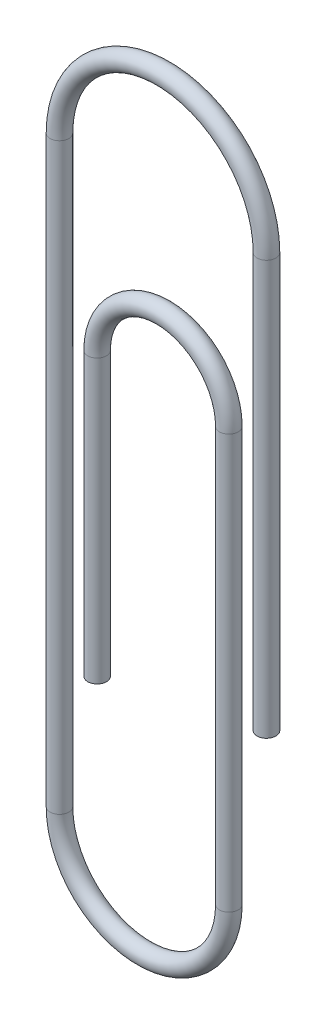
ISO-10303-21;
HEADER;
FILE_DESCRIPTION(('STEP AP214'),'2;1');
FILE_NAME('part.step','',(''),(''),'','','');
FILE_SCHEMA(('AUTOMOTIVE_DESIGN { 1 0 10303 214 1 1 1 1 }'));
ENDSEC;
DATA;
#1=APPLICATION_CONTEXT('core data for automotive mechanical design processes');
#2=APPLICATION_PROTOCOL_DEFINITION('international standard','automotive_design',2000,#1);
#3=PRODUCT_CONTEXT('',#1,'mechanical');
#4=PRODUCT('Part','Part','',(#3));
#5=PRODUCT_RELATED_PRODUCT_CATEGORY('part','',(#4));
#6=PRODUCT_DEFINITION_FORMATION('','',#4);
#7=PRODUCT_DEFINITION_CONTEXT('part definition',#1,'design');
#8=PRODUCT_DEFINITION('design','',#6,#7);
#9=PRODUCT_DEFINITION_SHAPE('','',#8);
#10=(LENGTH_UNIT() NAMED_UNIT(*) SI_UNIT(.MILLI.,.METRE.));
#11=(NAMED_UNIT(*) PLANE_ANGLE_UNIT() SI_UNIT($,.RADIAN.));
#12=(NAMED_UNIT(*) SI_UNIT($,.STERADIAN.) SOLID_ANGLE_UNIT());
#13=UNCERTAINTY_MEASURE_WITH_UNIT(LENGTH_MEASURE(1.E-05),#10,'distance_accuracy_value','');
#14=(GEOMETRIC_REPRESENTATION_CONTEXT(3) GLOBAL_UNCERTAINTY_ASSIGNED_CONTEXT((#13)) GLOBAL_UNIT_ASSIGNED_CONTEXT((#10,
#11,#12)) REPRESENTATION_CONTEXT('',''));
#15=CARTESIAN_POINT('',(0.,0.,0.));
#16=DIRECTION('',(0.,0.,1.));
#17=DIRECTION('',(1.,0.,0.));
#18=AXIS2_PLACEMENT_3D('',#15,#16,#17);
#19=CARTESIAN_POINT('',(2.,9.,0.));
#20=DIRECTION('',(0.,1.,0.));
#21=DIRECTION('',(-1.,0.,0.));
#22=AXIS2_PLACEMENT_3D('',#19,#20,#21);
#23=PLANE('',#22);
#24=CARTESIAN_POINT('',(2.,9.,0.));
#25=DIRECTION('',(0.,1.,0.));
#26=DIRECTION('',(-1.,0.,0.));
#27=AXIS2_PLACEMENT_3D('',#24,#25,#26);
#28=CIRCLE('',#27,0.5);
#29=CARTESIAN_POINT('',(1.5,9.,0.));
#30=VERTEX_POINT('',#29);
#31=EDGE_CURVE('E87',#30,#30,#28,.T.);
#32=ORIENTED_EDGE('',*,*,#31,.F.);
#33=EDGE_LOOP('',(#32));
#34=FACE_BOUND('',#33,.T.);
#35=ADVANCED_FACE('F61',(#34),#23,.F.);
#36=CARTESIAN_POINT('',(-7.,7.,0.));
#37=DIRECTION('',(0.,-1.,0.));
#38=DIRECTION('',(1.,0.,0.));
#39=AXIS2_PLACEMENT_3D('',#36,#37,#38);
#40=PLANE('',#39);
#41=CARTESIAN_POINT('',(-7.,7.,0.));
#42=DIRECTION('',(0.,-1.,0.));
#43=DIRECTION('',(1.,0.,0.));
#44=AXIS2_PLACEMENT_3D('',#41,#42,#43);
#45=CIRCLE('',#44,0.5);
#46=CARTESIAN_POINT('',(-6.5,7.,0.));
#47=VERTEX_POINT('',#46);
#48=EDGE_CURVE('E13',#47,#47,#45,.T.);
#49=ORIENTED_EDGE('',*,*,#48,.T.);
#50=EDGE_LOOP('',(#49));
#51=FACE_BOUND('',#50,.T.);
#52=ADVANCED_FACE('F96',(#51),#40,.T.);
#53=CARTESIAN_POINT('',(2.,9.,0.));
#54=DIRECTION('',(0.,1.,0.));
#55=DIRECTION('',(-1.,0.,0.));
#56=AXIS2_PLACEMENT_3D('',#53,#54,#55);
#57=CYLINDRICAL_SURFACE('',#56,0.5);
#58=CARTESIAN_POINT('',(2.,31.,0.));
#59=DIRECTION('',(0.,1.,0.));
#60=DIRECTION('',(-1.,0.,0.));
#61=AXIS2_PLACEMENT_3D('',#58,#59,#60);
#62=CIRCLE('',#61,0.5);
#63=CARTESIAN_POINT('',(2.5,31.,0.));
#64=VERTEX_POINT('',#63);
#65=EDGE_CURVE('E86',#64,#64,#62,.T.);
#66=ORIENTED_EDGE('',*,*,#65,.F.);
#67=EDGE_LOOP('',(#66));
#68=FACE_BOUND('',#67,.T.);
#69=ORIENTED_EDGE('',*,*,#31,.T.);
#70=EDGE_LOOP('',(#69));
#71=FACE_BOUND('',#70,.T.);
#72=ADVANCED_FACE('F93',(#68,#71),#57,.T.);
#73=CARTESIAN_POINT('',(-3.5,31.,0.));
#74=DIRECTION('',(0.,0.,1.));
#75=DIRECTION('',(1.,0.,0.));
#76=AXIS2_PLACEMENT_3D('',#73,#74,#75);
#77=TOROIDAL_SURFACE('',#76,5.5,0.5);
#78=CARTESIAN_POINT('',(-9.00000000000001,31.,0.));
#79=DIRECTION('',(0.,-1.,0.));
#80=DIRECTION('',(1.,0.,0.));
#81=AXIS2_PLACEMENT_3D('',#78,#79,#80);
#82=CIRCLE('',#81,0.5);
#83=CARTESIAN_POINT('',(-9.5,31.,0.));
#84=VERTEX_POINT('',#83);
#85=EDGE_CURVE('E81',#84,#84,#82,.T.);
#86=CARTESIAN_POINT('',(-3.5,31.,0.));
#87=DIRECTION('',(0.,0.,1.));
#88=DIRECTION('',(1.,0.,0.));
#89=AXIS2_PLACEMENT_3D('',#86,#87,#88);
#90=CIRCLE('',#89,6.);
#91=EDGE_CURVE('',#64,#84,#90,.T.);
#92=ORIENTED_EDGE('',*,*,#65,.T.);
#93=ORIENTED_EDGE('',*,*,#85,.F.);
#94=ORIENTED_EDGE('',*,*,#91,.T.);
#95=ORIENTED_EDGE('',*,*,#91,.F.);
#96=EDGE_LOOP('',(#92,#94,#93,#95));
#97=FACE_BOUND('',#96,.T.);
#98=ADVANCED_FACE('F122',(#97),#77,.T.);
#99=CARTESIAN_POINT('',(-9.00000000000001,31.,0.));
#100=DIRECTION('',(0.,-1.,0.));
#101=DIRECTION('',(1.,0.,0.));
#102=AXIS2_PLACEMENT_3D('',#99,#100,#101);
#103=CYLINDRICAL_SURFACE('',#102,0.5);
#104=CARTESIAN_POINT('',(-9.,0.,0.));
#105=DIRECTION('',(0.,-1.,0.));
#106=DIRECTION('',(1.,0.,0.));
#107=AXIS2_PLACEMENT_3D('',#104,#105,#106);
#108=CIRCLE('',#107,0.5);
#109=CARTESIAN_POINT('',(-9.5,0.,0.));
#110=VERTEX_POINT('',#109);
#111=EDGE_CURVE('E79',#110,#110,#108,.T.);
#112=ORIENTED_EDGE('',*,*,#111,.F.);
#113=EDGE_LOOP('',(#112));
#114=FACE_BOUND('',#113,.T.);
#115=ORIENTED_EDGE('',*,*,#85,.T.);
#116=EDGE_LOOP('',(#115));
#117=FACE_BOUND('',#116,.T.);
#118=ADVANCED_FACE('F119',(#114,#117),#103,.T.);
#119=CARTESIAN_POINT('',(-4.5,0.,0.));
#120=DIRECTION('',(0.,0.,1.));
#121=DIRECTION('',(1.,0.,0.));
#122=AXIS2_PLACEMENT_3D('',#119,#120,#121);
#123=TOROIDAL_SURFACE('',#122,4.5,0.5);
#124=CARTESIAN_POINT('',(0.,0.,0.));
#125=DIRECTION('',(0.,1.,0.));
#126=DIRECTION('',(-1.,0.,0.));
#127=AXIS2_PLACEMENT_3D('',#124,#125,#126);
#128=CIRCLE('',#127,0.5);
#129=CARTESIAN_POINT('',(0.500000000000001,0.,0.));
#130=VERTEX_POINT('',#129);
#131=EDGE_CURVE('E75',#130,#130,#128,.T.);
#132=CARTESIAN_POINT('',(-4.5,0.,0.));
#133=DIRECTION('',(0.,0.,1.));
#134=DIRECTION('',(1.,0.,0.));
#135=AXIS2_PLACEMENT_3D('',#132,#133,#134);
#136=CIRCLE('',#135,5.);
#137=EDGE_CURVE('',#110,#130,#136,.T.);
#138=ORIENTED_EDGE('',*,*,#111,.T.);
#139=ORIENTED_EDGE('',*,*,#131,.F.);
#140=ORIENTED_EDGE('',*,*,#137,.T.);
#141=ORIENTED_EDGE('',*,*,#137,.F.);
#142=EDGE_LOOP('',(#138,#140,#139,#141));
#143=FACE_BOUND('',#142,.T.);
#144=ADVANCED_FACE('F114',(#143),#123,.T.);
#145=CARTESIAN_POINT('',(0.,0.,0.));
#146=DIRECTION('',(0.,1.,0.));
#147=DIRECTION('',(0.,0.,1.));
#148=AXIS2_PLACEMENT_3D('',#145,#146,#147);
#149=CYLINDRICAL_SURFACE('',#148,0.5);
#150=CARTESIAN_POINT('',(0.,22.,0.));
#151=DIRECTION('',(0.,1.,0.));
#152=DIRECTION('',(-1.,0.,0.));
#153=AXIS2_PLACEMENT_3D('',#150,#151,#152);
#154=CIRCLE('',#153,0.5);
#155=CARTESIAN_POINT('',(0.5,22.,0.));
#156=VERTEX_POINT('',#155);
#157=EDGE_CURVE('E71',#156,#156,#154,.T.);
#158=ORIENTED_EDGE('',*,*,#157,.F.);
#159=EDGE_LOOP('',(#158));
#160=FACE_BOUND('',#159,.T.);
#161=ORIENTED_EDGE('',*,*,#131,.T.);
#162=EDGE_LOOP('',(#161));
#163=FACE_BOUND('',#162,.T.);
#164=ADVANCED_FACE('F109',(#160,#163),#149,.T.);
#165=CARTESIAN_POINT('',(-3.5,22.,0.));
#166=DIRECTION('',(0.,0.,1.));
#167=DIRECTION('',(1.,0.,0.));
#168=AXIS2_PLACEMENT_3D('',#165,#166,#167);
#169=TOROIDAL_SURFACE('',#168,3.5,0.5);
#170=CARTESIAN_POINT('',(-7.,22.,0.));
#171=DIRECTION('',(0.,-1.,0.));
#172=DIRECTION('',(1.,0.,0.));
#173=AXIS2_PLACEMENT_3D('',#170,#171,#172);
#174=CIRCLE('',#173,0.5);
#175=CARTESIAN_POINT('',(-7.5,22.,0.));
#176=VERTEX_POINT('',#175);
#177=EDGE_CURVE('E70',#176,#176,#174,.T.);
#178=CARTESIAN_POINT('',(-3.5,22.,0.));
#179=DIRECTION('',(0.,0.,1.));
#180=DIRECTION('',(1.,0.,0.));
#181=AXIS2_PLACEMENT_3D('',#178,#179,#180);
#182=CIRCLE('',#181,4.);
#183=EDGE_CURVE('',#156,#176,#182,.T.);
#184=ORIENTED_EDGE('',*,*,#157,.T.);
#185=ORIENTED_EDGE('',*,*,#177,.F.);
#186=ORIENTED_EDGE('',*,*,#183,.T.);
#187=ORIENTED_EDGE('',*,*,#183,.F.);
#188=EDGE_LOOP('',(#184,#186,#185,#187));
#189=FACE_BOUND('',#188,.T.);
#190=ADVANCED_FACE('F105',(#189),#169,.T.);
#191=CARTESIAN_POINT('',(-7.,22.,0.));
#192=DIRECTION('',(0.,-1.,0.));
#193=DIRECTION('',(1.,0.,0.));
#194=AXIS2_PLACEMENT_3D('',#191,#192,#193);
#195=CYLINDRICAL_SURFACE('',#194,0.5);
#196=ORIENTED_EDGE('',*,*,#48,.F.);
#197=EDGE_LOOP('',(#196));
#198=FACE_BOUND('',#197,.T.);
#199=ORIENTED_EDGE('',*,*,#177,.T.);
#200=EDGE_LOOP('',(#199));
#201=FACE_BOUND('',#200,.T.);
#202=ADVANCED_FACE('F99',(#198,#201),#195,.T.);
#203=CLOSED_SHELL('',(#35,#52,#72,#98,#118,#144,#164,#190,#202));
#204=MANIFOLD_SOLID_BREP('B2',#203);
#205=ADVANCED_BREP_SHAPE_REPRESENTATION('',(#18,#204),#14);
#206=SHAPE_DEFINITION_REPRESENTATION(#9,#205);
ENDSEC;
END-ISO-10303-21;
